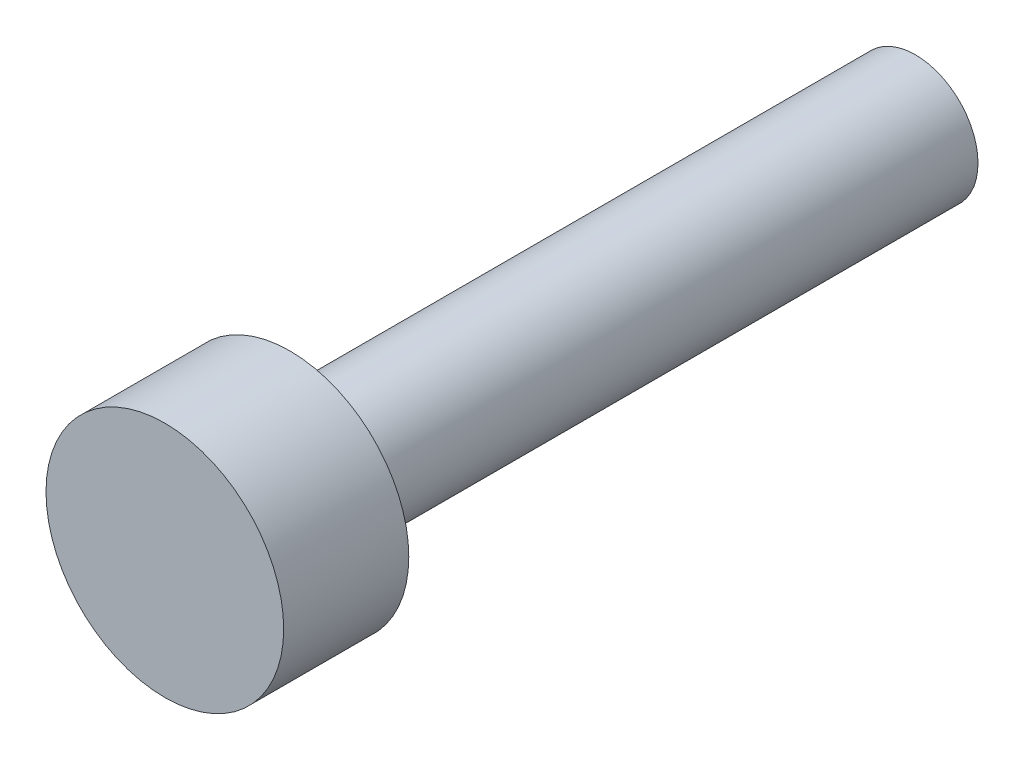
ISO-10303-21;
HEADER;
FILE_DESCRIPTION(('STEP AP214'),'2;1');
FILE_NAME('part.step','',(''),(''),'','','');
FILE_SCHEMA(('AUTOMOTIVE_DESIGN { 1 0 10303 214 1 1 1 1 }'));
ENDSEC;
DATA;
#1=APPLICATION_CONTEXT('core data for automotive mechanical design processes');
#2=APPLICATION_PROTOCOL_DEFINITION('international standard','automotive_design',2000,#1);
#3=PRODUCT_CONTEXT('',#1,'mechanical');
#4=PRODUCT('Part','Part','',(#3));
#5=PRODUCT_RELATED_PRODUCT_CATEGORY('part','',(#4));
#6=PRODUCT_DEFINITION_FORMATION('','',#4);
#7=PRODUCT_DEFINITION_CONTEXT('part definition',#1,'design');
#8=PRODUCT_DEFINITION('design','',#6,#7);
#9=PRODUCT_DEFINITION_SHAPE('','',#8);
#10=(LENGTH_UNIT() NAMED_UNIT(*) SI_UNIT(.MILLI.,.METRE.));
#11=(NAMED_UNIT(*) PLANE_ANGLE_UNIT() SI_UNIT($,.RADIAN.));
#12=(NAMED_UNIT(*) SI_UNIT($,.STERADIAN.) SOLID_ANGLE_UNIT());
#13=UNCERTAINTY_MEASURE_WITH_UNIT(LENGTH_MEASURE(1.E-05),#10,'distance_accuracy_value','');
#14=(GEOMETRIC_REPRESENTATION_CONTEXT(3) GLOBAL_UNCERTAINTY_ASSIGNED_CONTEXT((#13)) GLOBAL_UNIT_ASSIGNED_CONTEXT((#10,
#11,#12)) REPRESENTATION_CONTEXT('',''));
#15=CARTESIAN_POINT('',(0.,0.,0.));
#16=DIRECTION('',(0.,0.,1.));
#17=DIRECTION('',(1.,0.,0.));
#18=AXIS2_PLACEMENT_3D('',#15,#16,#17);
#19=CARTESIAN_POINT('',(0.,0.,0.));
#20=DIRECTION('',(0.,0.,-1.));
#21=DIRECTION('',(-1.,0.,0.));
#22=AXIS2_PLACEMENT_3D('',#19,#20,#21);
#23=CYLINDRICAL_SURFACE('',#22,1.);
#24=CARTESIAN_POINT('',(0.,0.,0.));
#25=DIRECTION('',(0.,0.,1.));
#26=DIRECTION('',(1.,0.,0.));
#27=AXIS2_PLACEMENT_3D('',#24,#25,#26);
#28=CIRCLE('',#27,1.);
#29=CARTESIAN_POINT('',(1.,0.,0.));
#30=VERTEX_POINT('',#29);
#31=EDGE_CURVE('E10',#30,#30,#28,.T.);
#32=ORIENTED_EDGE('',*,*,#31,.F.);
#33=EDGE_LOOP('',(#32));
#34=FACE_BOUND('',#33,.T.);
#35=CARTESIAN_POINT('',(0.,0.,-10.));
#36=DIRECTION('',(0.,0.,1.));
#37=DIRECTION('',(1.,0.,0.));
#38=AXIS2_PLACEMENT_3D('',#35,#36,#37);
#39=CIRCLE('',#38,1.);
#40=CARTESIAN_POINT('',(1.,0.,-10.));
#41=VERTEX_POINT('',#40);
#42=EDGE_CURVE('E37',#41,#41,#39,.T.);
#43=ORIENTED_EDGE('',*,*,#42,.T.);
#44=EDGE_LOOP('',(#43));
#45=FACE_BOUND('',#44,.T.);
#46=ADVANCED_FACE('F40',(#34,#45),#23,.T.);
#47=CARTESIAN_POINT('',(0.,0.,-10.));
#48=DIRECTION('',(0.,0.,1.));
#49=DIRECTION('',(1.,0.,0.));
#50=AXIS2_PLACEMENT_3D('',#47,#48,#49);
#51=PLANE('',#50);
#52=ORIENTED_EDGE('',*,*,#42,.F.);
#53=EDGE_LOOP('',(#52));
#54=FACE_BOUND('',#53,.T.);
#55=ADVANCED_FACE('F58',(#54),#51,.F.);
#56=CARTESIAN_POINT('',(0.,0.,2.));
#57=DIRECTION('',(0.,0.,-1.));
#58=DIRECTION('',(-1.,0.,0.));
#59=AXIS2_PLACEMENT_3D('',#56,#57,#58);
#60=CYLINDRICAL_SURFACE('',#59,1.9);
#61=CARTESIAN_POINT('',(0.,0.,2.));
#62=DIRECTION('',(0.,0.,1.));
#63=DIRECTION('',(1.,0.,0.));
#64=AXIS2_PLACEMENT_3D('',#61,#62,#63);
#65=CIRCLE('',#64,1.9);
#66=CARTESIAN_POINT('',(1.9,0.,2.));
#67=VERTEX_POINT('',#66);
#68=EDGE_CURVE('E50',#67,#67,#65,.T.);
#69=ORIENTED_EDGE('',*,*,#68,.F.);
#70=EDGE_LOOP('',(#69));
#71=FACE_BOUND('',#70,.T.);
#72=CARTESIAN_POINT('',(0.,0.,0.));
#73=DIRECTION('',(0.,0.,1.));
#74=DIRECTION('',(1.,0.,0.));
#75=AXIS2_PLACEMENT_3D('',#72,#73,#74);
#76=CIRCLE('',#75,1.9);
#77=CARTESIAN_POINT('',(1.9,0.,0.));
#78=VERTEX_POINT('',#77);
#79=EDGE_CURVE('E47',#78,#78,#76,.T.);
#80=ORIENTED_EDGE('',*,*,#79,.T.);
#81=EDGE_LOOP('',(#80));
#82=FACE_BOUND('',#81,.T.);
#83=ADVANCED_FACE('F60',(#71,#82),#60,.T.);
#84=CARTESIAN_POINT('',(0.,0.,2.));
#85=DIRECTION('',(0.,0.,1.));
#86=DIRECTION('',(1.,0.,0.));
#87=AXIS2_PLACEMENT_3D('',#84,#85,#86);
#88=PLANE('',#87);
#89=ORIENTED_EDGE('',*,*,#68,.T.);
#90=EDGE_LOOP('',(#89));
#91=FACE_BOUND('',#90,.T.);
#92=ADVANCED_FACE('F54',(#91),#88,.T.);
#93=CARTESIAN_POINT('',(0.,0.,0.));
#94=DIRECTION('',(0.,0.,1.));
#95=DIRECTION('',(1.,0.,0.));
#96=AXIS2_PLACEMENT_3D('',#93,#94,#95);
#97=PLANE('',#96);
#98=ORIENTED_EDGE('',*,*,#31,.T.);
#99=EDGE_LOOP('',(#98));
#100=FACE_BOUND('',#99,.T.);
#101=ORIENTED_EDGE('',*,*,#79,.F.);
#102=EDGE_LOOP('',(#101));
#103=FACE_BOUND('',#102,.T.);
#104=ADVANCED_FACE('F63',(#100,#103),#97,.F.);
#105=CLOSED_SHELL('',(#46,#55,#83,#92,#104));
#106=MANIFOLD_SOLID_BREP('B2',#105);
#107=ADVANCED_BREP_SHAPE_REPRESENTATION('',(#18,#106),#14);
#108=SHAPE_DEFINITION_REPRESENTATION(#9,#107);
ENDSEC;
END-ISO-10303-21;
